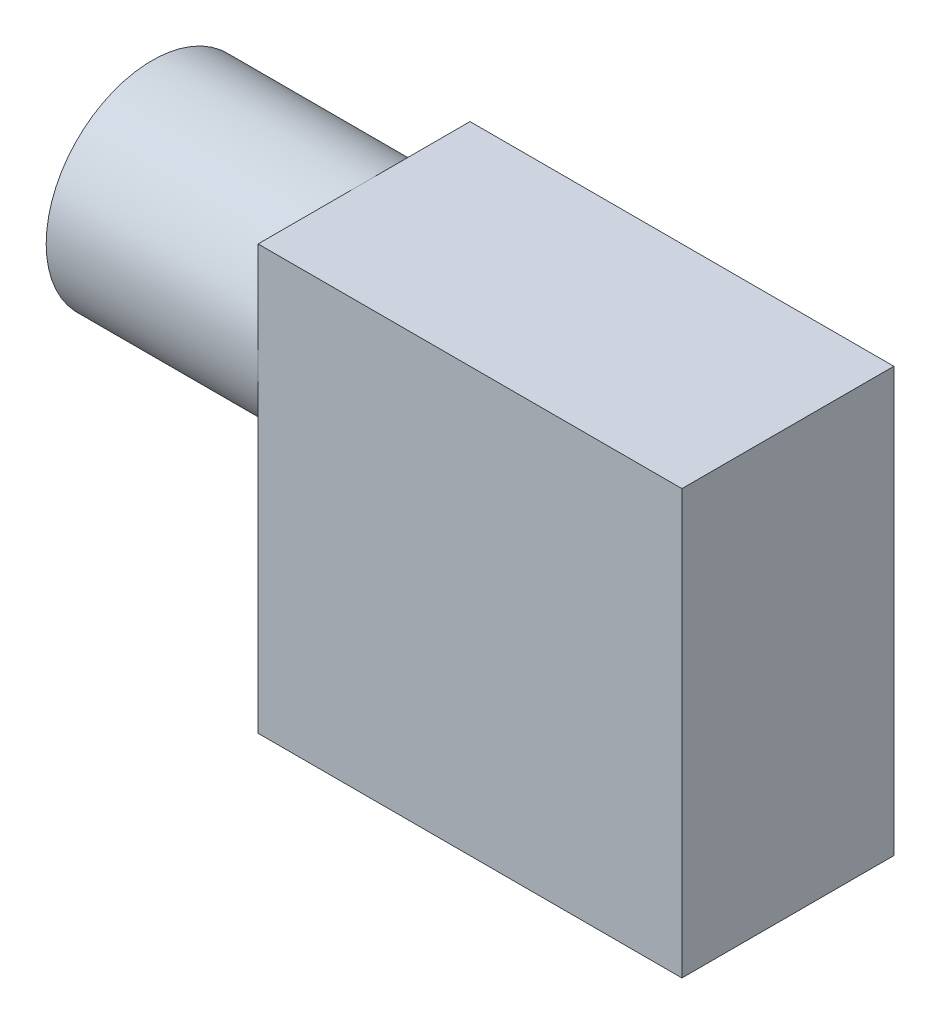
ISO-10303-21;
HEADER;
FILE_DESCRIPTION(('STEP AP214'),'2;1');
FILE_NAME('part.step','',(''),(''),'','','');
FILE_SCHEMA(('AUTOMOTIVE_DESIGN { 1 0 10303 214 1 1 1 1 }'));
ENDSEC;
DATA;
#1=APPLICATION_CONTEXT('core data for automotive mechanical design processes');
#2=APPLICATION_PROTOCOL_DEFINITION('international standard','automotive_design',2000,#1);
#3=PRODUCT_CONTEXT('',#1,'mechanical');
#4=PRODUCT('Part','Part','',(#3));
#5=PRODUCT_RELATED_PRODUCT_CATEGORY('part','',(#4));
#6=PRODUCT_DEFINITION_FORMATION('','',#4);
#7=PRODUCT_DEFINITION_CONTEXT('part definition',#1,'design');
#8=PRODUCT_DEFINITION('design','',#6,#7);
#9=PRODUCT_DEFINITION_SHAPE('','',#8);
#10=(LENGTH_UNIT() NAMED_UNIT(*) SI_UNIT(.MILLI.,.METRE.));
#11=(NAMED_UNIT(*) PLANE_ANGLE_UNIT() SI_UNIT($,.RADIAN.));
#12=(NAMED_UNIT(*) SI_UNIT($,.STERADIAN.) SOLID_ANGLE_UNIT());
#13=UNCERTAINTY_MEASURE_WITH_UNIT(LENGTH_MEASURE(1.E-05),#10,'distance_accuracy_value','');
#14=(GEOMETRIC_REPRESENTATION_CONTEXT(3) GLOBAL_UNCERTAINTY_ASSIGNED_CONTEXT((#13)) GLOBAL_UNIT_ASSIGNED_CONTEXT((#10,
#11,#12)) REPRESENTATION_CONTEXT('',''));
#15=CARTESIAN_POINT('',(0.,0.,0.));
#16=DIRECTION('',(0.,0.,1.));
#17=DIRECTION('',(1.,0.,0.));
#18=AXIS2_PLACEMENT_3D('',#15,#16,#17);
#19=CARTESIAN_POINT('',(0.,-20.,10.));
#20=DIRECTION('',(1.,0.,0.));
#21=DIRECTION('',(0.,0.,-1.));
#22=AXIS2_PLACEMENT_3D('',#19,#20,#21);
#23=PLANE('',#22);
#24=CARTESIAN_POINT('',(0.,-5.,5.));
#25=DIRECTION('',(-1.,0.,0.));
#26=DIRECTION('',(0.,0.,1.));
#27=AXIS2_PLACEMENT_3D('',#24,#25,#26);
#28=CIRCLE('',#27,5.);
#29=CARTESIAN_POINT('',(0.,-5.,10.));
#30=VERTEX_POINT('',#29);
#31=CARTESIAN_POINT('',(0.,0.,5.));
#32=VERTEX_POINT('',#31);
#33=EDGE_CURVE('E51',#30,#32,#28,.T.);
#34=ORIENTED_EDGE('',*,*,#33,.F.);
#35=DIRECTION('',(0.,-1.,0.));
#36=VECTOR('',#35,1.);
#37=CARTESIAN_POINT('',(0.,-20.,10.));
#38=LINE('',#37,#36);
#39=CARTESIAN_POINT('',(0.,0.,10.));
#40=VERTEX_POINT('',#39);
#41=EDGE_CURVE('E91',#40,#30,#38,.T.);
#42=ORIENTED_EDGE('',*,*,#41,.F.);
#43=DIRECTION('',(0.,0.,-1.));
#44=VECTOR('',#43,1.);
#45=CARTESIAN_POINT('',(0.,0.,10.));
#46=LINE('',#45,#44);
#47=EDGE_CURVE('E107',#40,#32,#46,.T.);
#48=ORIENTED_EDGE('',*,*,#47,.T.);
#49=EDGE_LOOP('',(#34,#42,#48));
#50=FACE_BOUND('',#49,.T.);
#51=ADVANCED_FACE('F40',(#50),#23,.F.);
#52=CARTESIAN_POINT('',(0.,-5.,0.));
#53=VERTEX_POINT('',#52);
#54=EDGE_CURVE('E11',#32,#53,#28,.T.);
#55=ORIENTED_EDGE('',*,*,#54,.F.);
#56=CARTESIAN_POINT('',(0.,0.,0.));
#57=VERTEX_POINT('',#56);
#58=EDGE_CURVE('E118',#32,#57,#46,.T.);
#59=ORIENTED_EDGE('',*,*,#58,.T.);
#60=DIRECTION('',(0.,-1.,0.));
#61=VECTOR('',#60,1.);
#62=CARTESIAN_POINT('',(0.,-20.,0.));
#63=LINE('',#62,#61);
#64=EDGE_CURVE('E119',#57,#53,#63,.T.);
#65=ORIENTED_EDGE('',*,*,#64,.T.);
#66=EDGE_LOOP('',(#55,#59,#65));
#67=FACE_BOUND('',#66,.T.);
#68=ADVANCED_FACE('F146',(#67),#23,.F.);
#69=EDGE_CURVE('E49',#53,#30,#28,.T.);
#70=ORIENTED_EDGE('',*,*,#69,.F.);
#71=CARTESIAN_POINT('',(0.,-20.,0.));
#72=VERTEX_POINT('',#71);
#73=EDGE_CURVE('E122',#53,#72,#63,.T.);
#74=ORIENTED_EDGE('',*,*,#73,.T.);
#75=DIRECTION('',(0.,0.,-1.));
#76=VECTOR('',#75,1.);
#77=CARTESIAN_POINT('',(0.,-20.,10.));
#78=LINE('',#77,#76);
#79=CARTESIAN_POINT('',(0.,-20.,10.));
#80=VERTEX_POINT('',#79);
#81=EDGE_CURVE('E44',#80,#72,#78,.T.);
#82=ORIENTED_EDGE('',*,*,#81,.F.);
#83=EDGE_CURVE('E93',#30,#80,#38,.T.);
#84=ORIENTED_EDGE('',*,*,#83,.F.);
#85=EDGE_LOOP('',(#70,#74,#82,#84));
#86=FACE_BOUND('',#85,.T.);
#87=ADVANCED_FACE('F42',(#86),#23,.F.);
#88=CARTESIAN_POINT('',(20.,-20.,10.));
#89=DIRECTION('',(0.,1.,0.));
#90=DIRECTION('',(-1.,0.,0.));
#91=AXIS2_PLACEMENT_3D('',#88,#89,#90);
#92=PLANE('',#91);
#93=DIRECTION('',(1.,0.,0.));
#94=VECTOR('',#93,1.);
#95=CARTESIAN_POINT('',(20.,-20.,0.));
#96=LINE('',#95,#94);
#97=CARTESIAN_POINT('',(20.,-20.,0.));
#98=VERTEX_POINT('',#97);
#99=EDGE_CURVE('E121',#72,#98,#96,.T.);
#100=ORIENTED_EDGE('',*,*,#99,.T.);
#101=DIRECTION('',(0.,0.,-1.));
#102=VECTOR('',#101,1.);
#103=CARTESIAN_POINT('',(20.,-20.,10.));
#104=LINE('',#103,#102);
#105=CARTESIAN_POINT('',(20.,-20.,10.));
#106=VERTEX_POINT('',#105);
#107=EDGE_CURVE('E111',#106,#98,#104,.T.);
#108=ORIENTED_EDGE('',*,*,#107,.F.);
#109=DIRECTION('',(1.,0.,0.));
#110=VECTOR('',#109,1.);
#111=CARTESIAN_POINT('',(20.,-20.,10.));
#112=LINE('',#111,#110);
#113=EDGE_CURVE('E101',#80,#106,#112,.T.);
#114=ORIENTED_EDGE('',*,*,#113,.F.);
#115=ORIENTED_EDGE('',*,*,#81,.T.);
#116=EDGE_LOOP('',(#100,#108,#114,#115));
#117=FACE_BOUND('',#116,.T.);
#118=ADVANCED_FACE('F152',(#117),#92,.F.);
#119=CARTESIAN_POINT('',(20.,0.,10.));
#120=DIRECTION('',(-1.,0.,0.));
#121=DIRECTION('',(0.,-1.,0.));
#122=AXIS2_PLACEMENT_3D('',#119,#120,#121);
#123=PLANE('',#122);
#124=DIRECTION('',(0.,1.,0.));
#125=VECTOR('',#124,1.);
#126=CARTESIAN_POINT('',(20.,0.,0.));
#127=LINE('',#126,#125);
#128=CARTESIAN_POINT('',(20.,0.,0.));
#129=VERTEX_POINT('',#128);
#130=EDGE_CURVE('E124',#98,#129,#127,.T.);
#131=ORIENTED_EDGE('',*,*,#130,.T.);
#132=DIRECTION('',(0.,0.,-1.));
#133=VECTOR('',#132,1.);
#134=CARTESIAN_POINT('',(20.,0.,10.));
#135=LINE('',#134,#133);
#136=CARTESIAN_POINT('',(20.,0.,10.));
#137=VERTEX_POINT('',#136);
#138=EDGE_CURVE('E129',#137,#129,#135,.T.);
#139=ORIENTED_EDGE('',*,*,#138,.F.);
#140=DIRECTION('',(0.,1.,0.));
#141=VECTOR('',#140,1.);
#142=CARTESIAN_POINT('',(20.,0.,10.));
#143=LINE('',#142,#141);
#144=EDGE_CURVE('E115',#106,#137,#143,.T.);
#145=ORIENTED_EDGE('',*,*,#144,.F.);
#146=ORIENTED_EDGE('',*,*,#107,.T.);
#147=EDGE_LOOP('',(#131,#139,#145,#146));
#148=FACE_BOUND('',#147,.T.);
#149=ADVANCED_FACE('F136',(#148),#123,.F.);
#150=CARTESIAN_POINT('',(0.,0.,10.));
#151=DIRECTION('',(0.,-1.,0.));
#152=DIRECTION('',(0.,0.,-1.));
#153=AXIS2_PLACEMENT_3D('',#150,#151,#152);
#154=PLANE('',#153);
#155=DIRECTION('',(-1.,0.,0.));
#156=VECTOR('',#155,1.);
#157=CARTESIAN_POINT('',(0.,0.,0.));
#158=LINE('',#157,#156);
#159=EDGE_CURVE('E105',#129,#57,#158,.T.);
#160=ORIENTED_EDGE('',*,*,#159,.T.);
#161=ORIENTED_EDGE('',*,*,#58,.F.);
#162=ORIENTED_EDGE('',*,*,#47,.F.);
#163=DIRECTION('',(-1.,0.,0.));
#164=VECTOR('',#163,1.);
#165=CARTESIAN_POINT('',(0.,0.,10.));
#166=LINE('',#165,#164);
#167=EDGE_CURVE('E96',#137,#40,#166,.T.);
#168=ORIENTED_EDGE('',*,*,#167,.F.);
#169=ORIENTED_EDGE('',*,*,#138,.T.);
#170=EDGE_LOOP('',(#160,#161,#162,#168,#169));
#171=FACE_BOUND('',#170,.T.);
#172=ADVANCED_FACE('F145',(#171),#154,.F.);
#173=CARTESIAN_POINT('',(0.,0.,10.));
#174=DIRECTION('',(0.,0.,-1.));
#175=DIRECTION('',(-1.,0.,0.));
#176=AXIS2_PLACEMENT_3D('',#173,#174,#175);
#177=PLANE('',#176);
#178=ORIENTED_EDGE('',*,*,#41,.T.);
#179=ORIENTED_EDGE('',*,*,#83,.T.);
#180=ORIENTED_EDGE('',*,*,#113,.T.);
#181=ORIENTED_EDGE('',*,*,#144,.T.);
#182=ORIENTED_EDGE('',*,*,#167,.T.);
#183=EDGE_LOOP('',(#178,#179,#180,#181,#182));
#184=FACE_BOUND('',#183,.T.);
#185=ADVANCED_FACE('F92',(#184),#177,.F.);
#186=CARTESIAN_POINT('',(0.,0.,0.));
#187=DIRECTION('',(0.,0.,-1.));
#188=DIRECTION('',(-1.,0.,0.));
#189=AXIS2_PLACEMENT_3D('',#186,#187,#188);
#190=PLANE('',#189);
#191=ORIENTED_EDGE('',*,*,#64,.F.);
#192=ORIENTED_EDGE('',*,*,#159,.F.);
#193=ORIENTED_EDGE('',*,*,#130,.F.);
#194=ORIENTED_EDGE('',*,*,#99,.F.);
#195=ORIENTED_EDGE('',*,*,#73,.F.);
#196=EDGE_LOOP('',(#191,#192,#193,#194,#195));
#197=FACE_BOUND('',#196,.T.);
#198=ADVANCED_FACE('F143',(#197),#190,.T.);
#199=CARTESIAN_POINT('',(-10.,-5.,5.));
#200=DIRECTION('',(1.,0.,0.));
#201=DIRECTION('',(0.,0.,-1.));
#202=AXIS2_PLACEMENT_3D('',#199,#200,#201);
#203=CYLINDRICAL_SURFACE('',#202,5.);
#204=CARTESIAN_POINT('',(-10.,-5.,5.));
#205=DIRECTION('',(-1.,0.,0.));
#206=DIRECTION('',(0.,0.,1.));
#207=AXIS2_PLACEMENT_3D('',#204,#205,#206);
#208=CIRCLE('',#207,5.);
#209=CARTESIAN_POINT('',(-10.,-5.,10.));
#210=VERTEX_POINT('',#209);
#211=EDGE_CURVE('E109',#210,#210,#208,.T.);
#212=ORIENTED_EDGE('',*,*,#211,.F.);
#213=EDGE_LOOP('',(#212));
#214=FACE_BOUND('',#213,.T.);
#215=ORIENTED_EDGE('',*,*,#33,.T.);
#216=ORIENTED_EDGE('',*,*,#54,.T.);
#217=ORIENTED_EDGE('',*,*,#69,.T.);
#218=EDGE_LOOP('',(#215,#216,#217));
#219=FACE_BOUND('',#218,.T.);
#220=ADVANCED_FACE('F110',(#214,#219),#203,.T.);
#221=CARTESIAN_POINT('',(-10.,-5.,5.));
#222=DIRECTION('',(-1.,0.,0.));
#223=DIRECTION('',(0.,0.,1.));
#224=AXIS2_PLACEMENT_3D('',#221,#222,#223);
#225=PLANE('',#224);
#226=ORIENTED_EDGE('',*,*,#211,.T.);
#227=EDGE_LOOP('',(#226));
#228=FACE_BOUND('',#227,.T.);
#229=ADVANCED_FACE('F210',(#228),#225,.T.);
#230=CLOSED_SHELL('',(#51,#68,#87,#118,#149,#172,#185,#198,#220,#229));
#231=MANIFOLD_SOLID_BREP('B2',#230);
#232=ADVANCED_BREP_SHAPE_REPRESENTATION('',(#18,#231),#14);
#233=SHAPE_DEFINITION_REPRESENTATION(#9,#232);
ENDSEC;
END-ISO-10303-21;
